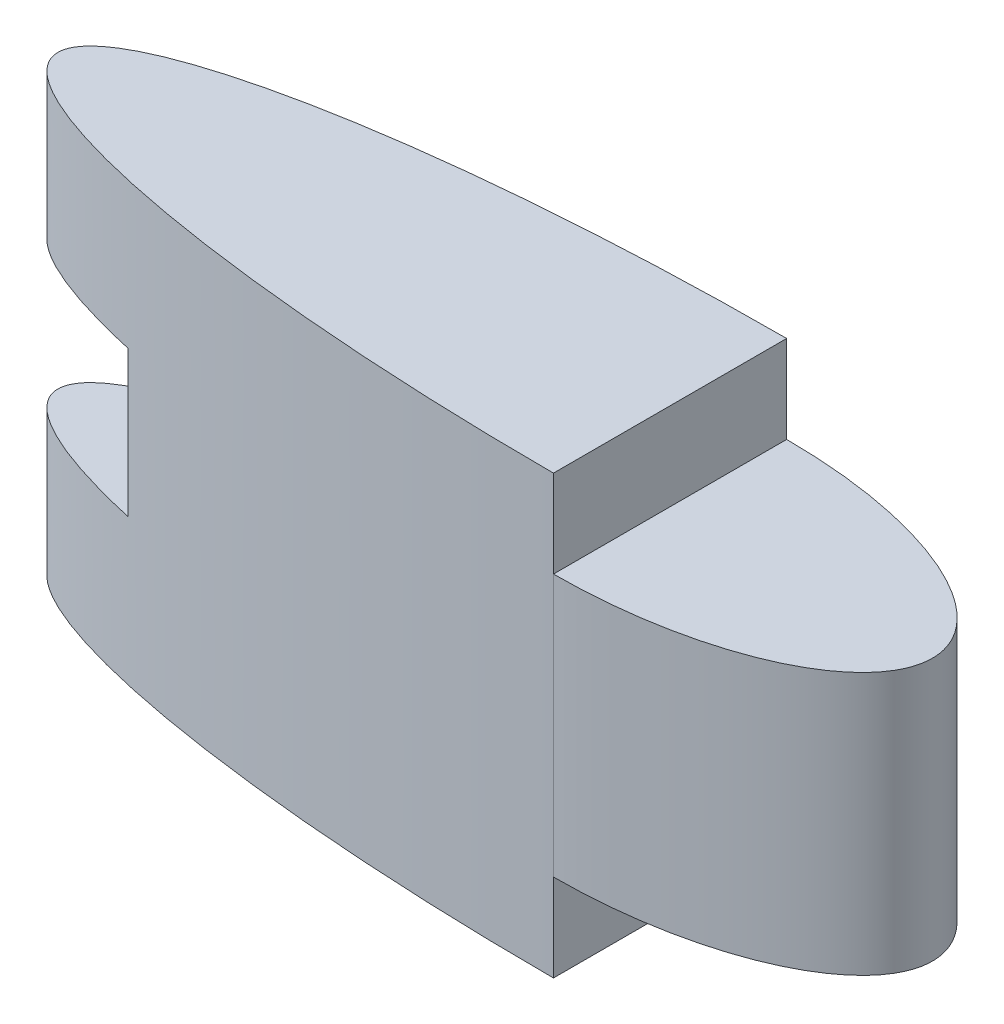
ISO-10303-21;
HEADER;
FILE_DESCRIPTION(('STEP AP214'),'2;1');
FILE_NAME('part.step','',(''),(''),'','','');
FILE_SCHEMA(('AUTOMOTIVE_DESIGN { 1 0 10303 214 1 1 1 1 }'));
ENDSEC;
DATA;
#1=APPLICATION_CONTEXT('core data for automotive mechanical design processes');
#2=APPLICATION_PROTOCOL_DEFINITION('international standard','automotive_design',2000,#1);
#3=PRODUCT_CONTEXT('',#1,'mechanical');
#4=PRODUCT('Part','Part','',(#3));
#5=PRODUCT_RELATED_PRODUCT_CATEGORY('part','',(#4));
#6=PRODUCT_DEFINITION_FORMATION('','',#4);
#7=PRODUCT_DEFINITION_CONTEXT('part definition',#1,'design');
#8=PRODUCT_DEFINITION('design','',#6,#7);
#9=PRODUCT_DEFINITION_SHAPE('','',#8);
#10=(LENGTH_UNIT() NAMED_UNIT(*) SI_UNIT(.MILLI.,.METRE.));
#11=(NAMED_UNIT(*) PLANE_ANGLE_UNIT() SI_UNIT($,.RADIAN.));
#12=(NAMED_UNIT(*) SI_UNIT($,.STERADIAN.) SOLID_ANGLE_UNIT());
#13=UNCERTAINTY_MEASURE_WITH_UNIT(LENGTH_MEASURE(1.E-05),#10,'distance_accuracy_value','');
#14=(GEOMETRIC_REPRESENTATION_CONTEXT(3) GLOBAL_UNCERTAINTY_ASSIGNED_CONTEXT((#13)) GLOBAL_UNIT_ASSIGNED_CONTEXT((#10,
#11,#12)) REPRESENTATION_CONTEXT('',''));
#15=CARTESIAN_POINT('',(0.,0.,0.));
#16=DIRECTION('',(0.,0.,1.));
#17=DIRECTION('',(1.,0.,0.));
#18=AXIS2_PLACEMENT_3D('',#15,#16,#17);
#19=CARTESIAN_POINT('',(-210.,50.,40.001));
#20=DIRECTION('',(0.,1.,0.));
#21=DIRECTION('',(-1.,0.,0.));
#22=AXIS2_PLACEMENT_3D('',#19,#20,#21);
#23=PLANE('',#22);
#24=DIRECTION('',(0.,0.,-1.));
#25=VECTOR('',#24,1.);
#26=CARTESIAN_POINT('',(-160.,50.,40.001));
#27=LINE('',#26,#25);
#28=CARTESIAN_POINT('',(-160.,50.,25.9075628737818));
#29=VERTEX_POINT('',#28);
#30=CARTESIAN_POINT('',(-160.,50.,-25.9075628737818));
#31=VERTEX_POINT('',#30);
#32=EDGE_CURVE('E272',#29,#31,#27,.T.);
#33=ORIENTED_EDGE('',*,*,#32,.T.);
#34=CARTESIAN_POINT('',(0.,50.,0.));
#35=DIRECTION('',(0.,1.,0.));
#36=DIRECTION('',(1.,0.,0.));
#37=AXIS2_PLACEMENT_3D('',#34,#35,#36);
#38=ELLIPSE('',#37,210.,40.);
#39=EDGE_CURVE('E278',#29,#31,#38,.F.);
#40=ORIENTED_EDGE('',*,*,#39,.F.);
#41=EDGE_LOOP('',(#33,#40));
#42=FACE_BOUND('',#41,.T.);
#43=ADVANCED_FACE('F42',(#42),#23,.T.);
#44=CARTESIAN_POINT('',(-160.,100.,40.001));
#45=DIRECTION('',(-1.,0.,0.));
#46=DIRECTION('',(0.,0.,1.));
#47=AXIS2_PLACEMENT_3D('',#44,#45,#46);
#48=PLANE('',#47);
#49=DIRECTION('',(0.,0.,-1.));
#50=VECTOR('',#49,1.);
#51=CARTESIAN_POINT('',(-160.,100.,40.001));
#52=LINE('',#51,#50);
#53=CARTESIAN_POINT('',(-160.,100.,25.9075628737818));
#54=VERTEX_POINT('',#53);
#55=CARTESIAN_POINT('',(-160.,100.,-25.9075628737818));
#56=VERTEX_POINT('',#55);
#57=EDGE_CURVE('E275',#54,#56,#52,.T.);
#58=ORIENTED_EDGE('',*,*,#57,.T.);
#59=DIRECTION('',(0.,-1.,0.));
#60=VECTOR('',#59,1.);
#61=CARTESIAN_POINT('',(-160.,150.,-25.9075628737818));
#62=LINE('',#61,#60);
#63=EDGE_CURVE('E261',#56,#31,#62,.T.);
#64=ORIENTED_EDGE('',*,*,#63,.T.);
#65=ORIENTED_EDGE('',*,*,#32,.F.);
#66=DIRECTION('',(0.,-1.,0.));
#67=VECTOR('',#66,1.);
#68=CARTESIAN_POINT('',(-160.,150.,25.9075628737818));
#69=LINE('',#68,#67);
#70=EDGE_CURVE('E59',#54,#29,#69,.T.);
#71=ORIENTED_EDGE('',*,*,#70,.F.);
#72=EDGE_LOOP('',(#58,#64,#65,#71));
#73=FACE_BOUND('',#72,.T.);
#74=ADVANCED_FACE('F150',(#73),#48,.T.);
#75=CARTESIAN_POINT('',(-210.,100.,40.001));
#76=DIRECTION('',(0.,-1.,0.));
#77=DIRECTION('',(0.,0.,-1.));
#78=AXIS2_PLACEMENT_3D('',#75,#76,#77);
#79=PLANE('',#78);
#80=ORIENTED_EDGE('',*,*,#57,.F.);
#81=CARTESIAN_POINT('',(0.,100.,0.));
#82=DIRECTION('',(0.,1.,0.));
#83=DIRECTION('',(1.,0.,0.));
#84=AXIS2_PLACEMENT_3D('',#81,#82,#83);
#85=ELLIPSE('',#84,210.,40.);
#86=EDGE_CURVE('E284',#56,#54,#85,.T.);
#87=ORIENTED_EDGE('',*,*,#86,.F.);
#88=EDGE_LOOP('',(#80,#87));
#89=FACE_BOUND('',#88,.T.);
#90=ADVANCED_FACE('F147',(#89),#79,.T.);
#91=CARTESIAN_POINT('',(0.,150.,0.));
#92=DIRECTION('',(0.,1.,0.));
#93=DIRECTION('',(1.,0.,0.));
#94=AXIS2_PLACEMENT_3D('',#91,#92,#93);
#95=ELLIPSE('',#94,210.,40.);
#96=DIRECTION('',(0.,-1.,0.));
#97=VECTOR('',#96,1.);
#98=SURFACE_OF_LINEAR_EXTRUSION('',#95,#97);
#99=CARTESIAN_POINT('',(0.,0.,0.));
#100=DIRECTION('',(0.,1.,0.));
#101=DIRECTION('',(1.,0.,0.));
#102=AXIS2_PLACEMENT_3D('',#99,#100,#101);
#103=ELLIPSE('',#102,210.,40.);
#104=CARTESIAN_POINT('',(0.,0.,-40.));
#105=VERTEX_POINT('',#104);
#106=CARTESIAN_POINT('',(0.,0.,40.));
#107=VERTEX_POINT('',#106);
#108=EDGE_CURVE('E130',#105,#107,#103,.T.);
#109=ORIENTED_EDGE('',*,*,#108,.T.);
#110=DIRECTION('',(0.,-1.,0.));
#111=VECTOR('',#110,1.);
#112=CARTESIAN_POINT('',(0.,150.,40.));
#113=LINE('',#112,#111);
#114=CARTESIAN_POINT('',(0.,30.,40.));
#115=VERTEX_POINT('',#114);
#116=EDGE_CURVE('E266',#115,#107,#113,.T.);
#117=ORIENTED_EDGE('',*,*,#116,.F.);
#118=DIRECTION('',(0.,-1.,0.));
#119=VECTOR('',#118,1.);
#120=CARTESIAN_POINT('',(0.,150.,40.));
#121=LINE('',#120,#119);
#122=CARTESIAN_POINT('',(0.,120.,40.));
#123=VERTEX_POINT('',#122);
#124=EDGE_CURVE('E52',#123,#115,#121,.T.);
#125=ORIENTED_EDGE('',*,*,#124,.F.);
#126=CARTESIAN_POINT('',(0.,150.,40.));
#127=VERTEX_POINT('',#126);
#128=EDGE_CURVE('E11',#127,#123,#121,.T.);
#129=ORIENTED_EDGE('',*,*,#128,.F.);
#130=CARTESIAN_POINT('',(0.,150.,-40.));
#131=VERTEX_POINT('',#130);
#132=EDGE_CURVE('E122',#131,#127,#95,.T.);
#133=ORIENTED_EDGE('',*,*,#132,.F.);
#134=DIRECTION('',(0.,-1.,0.));
#135=VECTOR('',#134,1.);
#136=CARTESIAN_POINT('',(0.,150.,-40.));
#137=LINE('',#136,#135);
#138=CARTESIAN_POINT('',(0.,120.,-40.));
#139=VERTEX_POINT('',#138);
#140=EDGE_CURVE('E68',#131,#139,#137,.T.);
#141=ORIENTED_EDGE('',*,*,#140,.T.);
#142=CARTESIAN_POINT('',(0.,30.,-40.));
#143=VERTEX_POINT('',#142);
#144=EDGE_CURVE('E115',#139,#143,#137,.T.);
#145=ORIENTED_EDGE('',*,*,#144,.T.);
#146=DIRECTION('',(0.,-1.,0.));
#147=VECTOR('',#146,1.);
#148=CARTESIAN_POINT('',(0.,150.,-40.));
#149=LINE('',#148,#147);
#150=EDGE_CURVE('E111',#143,#105,#149,.T.);
#151=ORIENTED_EDGE('',*,*,#150,.T.);
#152=EDGE_LOOP('',(#109,#117,#125,#129,#133,#141,#145,#151));
#153=FACE_BOUND('',#152,.T.);
#154=ORIENTED_EDGE('',*,*,#39,.T.);
#155=ORIENTED_EDGE('',*,*,#63,.F.);
#156=ORIENTED_EDGE('',*,*,#86,.T.);
#157=ORIENTED_EDGE('',*,*,#70,.T.);
#158=EDGE_LOOP('',(#154,#155,#156,#157));
#159=FACE_BOUND('',#158,.T.);
#160=ADVANCED_FACE('F44',(#153,#159),#98,.F.);
#161=CARTESIAN_POINT('',(0.,150.,0.));
#162=DIRECTION('',(0.,1.,0.));
#163=DIRECTION('',(-1.,0.,0.));
#164=AXIS2_PLACEMENT_3D('',#161,#162,#163);
#165=ELLIPSE('',#164,90.,40.);
#166=DIRECTION('',(0.,-1.,0.));
#167=VECTOR('',#166,1.);
#168=SURFACE_OF_LINEAR_EXTRUSION('',#165,#167);
#169=CARTESIAN_POINT('',(0.,120.,0.));
#170=DIRECTION('',(0.,1.,0.));
#171=DIRECTION('',(-1.,0.,0.));
#172=AXIS2_PLACEMENT_3D('',#169,#170,#171);
#173=ELLIPSE('',#172,90.,40.);
#174=EDGE_CURVE('E103',#139,#123,#173,.F.);
#175=ORIENTED_EDGE('',*,*,#174,.T.);
#176=ORIENTED_EDGE('',*,*,#124,.T.);
#177=CARTESIAN_POINT('',(0.,30.,0.));
#178=DIRECTION('',(0.,1.,0.));
#179=DIRECTION('',(-1.,0.,0.));
#180=AXIS2_PLACEMENT_3D('',#177,#178,#179);
#181=ELLIPSE('',#180,90.,40.);
#182=EDGE_CURVE('E118',#115,#143,#181,.T.);
#183=ORIENTED_EDGE('',*,*,#182,.T.);
#184=ORIENTED_EDGE('',*,*,#144,.F.);
#185=EDGE_LOOP('',(#175,#176,#183,#184));
#186=FACE_BOUND('',#185,.T.);
#187=ADVANCED_FACE('F116',(#186),#168,.F.);
#188=CARTESIAN_POINT('',(0.,150.,0.));
#189=DIRECTION('',(0.,1.,0.));
#190=DIRECTION('',(0.,0.,1.));
#191=AXIS2_PLACEMENT_3D('',#188,#189,#190);
#192=PLANE('',#191);
#193=ORIENTED_EDGE('',*,*,#132,.T.);
#194=DIRECTION('',(0.,0.,-1.));
#195=VECTOR('',#194,1.);
#196=CARTESIAN_POINT('',(0.,150.,40.001));
#197=LINE('',#196,#195);
#198=EDGE_CURVE('E102',#127,#131,#197,.T.);
#199=ORIENTED_EDGE('',*,*,#198,.T.);
#200=EDGE_LOOP('',(#193,#199));
#201=FACE_BOUND('',#200,.T.);
#202=ADVANCED_FACE('F138',(#201),#192,.T.);
#203=CARTESIAN_POINT('',(0.,0.,0.));
#204=DIRECTION('',(0.,1.,0.));
#205=DIRECTION('',(0.,0.,1.));
#206=AXIS2_PLACEMENT_3D('',#203,#204,#205);
#207=PLANE('',#206);
#208=DIRECTION('',(0.,0.,-1.));
#209=VECTOR('',#208,1.);
#210=CARTESIAN_POINT('',(0.,0.,40.001));
#211=LINE('',#210,#209);
#212=EDGE_CURVE('E260',#107,#105,#211,.T.);
#213=ORIENTED_EDGE('',*,*,#212,.F.);
#214=ORIENTED_EDGE('',*,*,#108,.F.);
#215=EDGE_LOOP('',(#213,#214));
#216=FACE_BOUND('',#215,.T.);
#217=ADVANCED_FACE('F139',(#216),#207,.F.);
#218=CARTESIAN_POINT('',(90.,30.,40.001));
#219=DIRECTION('',(0.,-1.,0.));
#220=DIRECTION('',(1.,0.,0.));
#221=AXIS2_PLACEMENT_3D('',#218,#219,#220);
#222=PLANE('',#221);
#223=DIRECTION('',(0.,0.,-1.));
#224=VECTOR('',#223,1.);
#225=CARTESIAN_POINT('',(0.,30.,40.001));
#226=LINE('',#225,#224);
#227=EDGE_CURVE('E256',#115,#143,#226,.T.);
#228=ORIENTED_EDGE('',*,*,#227,.T.);
#229=ORIENTED_EDGE('',*,*,#182,.F.);
#230=EDGE_LOOP('',(#228,#229));
#231=FACE_BOUND('',#230,.T.);
#232=ADVANCED_FACE('F142',(#231),#222,.T.);
#233=CARTESIAN_POINT('',(0.,0.,40.001));
#234=DIRECTION('',(1.,0.,0.));
#235=DIRECTION('',(0.,0.,-1.));
#236=AXIS2_PLACEMENT_3D('',#233,#234,#235);
#237=PLANE('',#236);
#238=ORIENTED_EDGE('',*,*,#212,.T.);
#239=ORIENTED_EDGE('',*,*,#150,.F.);
#240=ORIENTED_EDGE('',*,*,#227,.F.);
#241=ORIENTED_EDGE('',*,*,#116,.T.);
#242=EDGE_LOOP('',(#238,#239,#240,#241));
#243=FACE_BOUND('',#242,.T.);
#244=ADVANCED_FACE('F157',(#243),#237,.T.);
#245=CARTESIAN_POINT('',(0.,150.,40.001));
#246=DIRECTION('',(1.,0.,0.));
#247=DIRECTION('',(0.,1.,0.));
#248=AXIS2_PLACEMENT_3D('',#245,#246,#247);
#249=PLANE('',#248);
#250=DIRECTION('',(0.,0.,-1.));
#251=VECTOR('',#250,1.);
#252=CARTESIAN_POINT('',(0.,120.,40.001));
#253=LINE('',#252,#251);
#254=EDGE_CURVE('E95',#123,#139,#253,.T.);
#255=ORIENTED_EDGE('',*,*,#254,.T.);
#256=ORIENTED_EDGE('',*,*,#140,.F.);
#257=ORIENTED_EDGE('',*,*,#198,.F.);
#258=ORIENTED_EDGE('',*,*,#128,.T.);
#259=EDGE_LOOP('',(#255,#256,#257,#258));
#260=FACE_BOUND('',#259,.T.);
#261=ADVANCED_FACE('F97',(#260),#249,.T.);
#262=CARTESIAN_POINT('',(90.,120.,40.001));
#263=DIRECTION('',(0.,1.,0.));
#264=DIRECTION('',(-1.,0.,0.));
#265=AXIS2_PLACEMENT_3D('',#262,#263,#264);
#266=PLANE('',#265);
#267=ORIENTED_EDGE('',*,*,#254,.F.);
#268=ORIENTED_EDGE('',*,*,#174,.F.);
#269=EDGE_LOOP('',(#267,#268));
#270=FACE_BOUND('',#269,.T.);
#271=ADVANCED_FACE('F106',(#270),#266,.T.);
#272=CLOSED_SHELL('',(#43,#74,#90,#160,#187,#202,#217,#232,#244,#261,#271));
#273=MANIFOLD_SOLID_BREP('B2',#272);
#274=ADVANCED_BREP_SHAPE_REPRESENTATION('',(#18,#273),#14);
#275=SHAPE_DEFINITION_REPRESENTATION(#9,#274);
ENDSEC;
END-ISO-10303-21;
